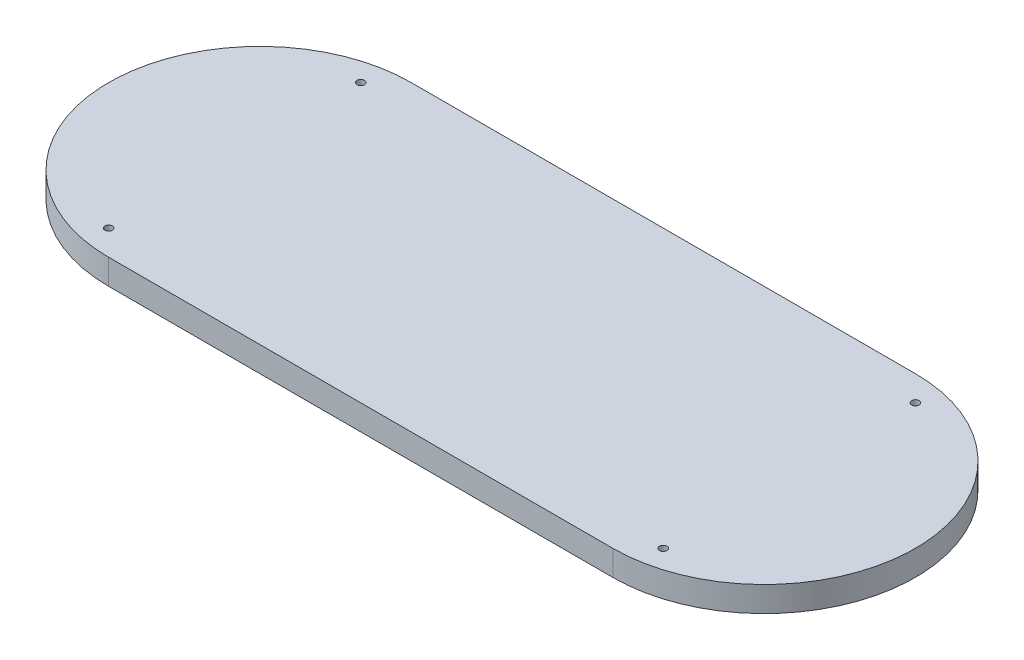
ISO-10303-21;
HEADER;
FILE_DESCRIPTION(('STEP AP214'),'2;1');
FILE_NAME('part.step','',(''),(''),'','','');
FILE_SCHEMA(('AUTOMOTIVE_DESIGN { 1 0 10303 214 1 1 1 1 }'));
ENDSEC;
DATA;
#1=APPLICATION_CONTEXT('core data for automotive mechanical design processes');
#2=APPLICATION_PROTOCOL_DEFINITION('international standard','automotive_design',2000,#1);
#3=PRODUCT_CONTEXT('',#1,'mechanical');
#4=PRODUCT('Part','Part','',(#3));
#5=PRODUCT_RELATED_PRODUCT_CATEGORY('part','',(#4));
#6=PRODUCT_DEFINITION_FORMATION('','',#4);
#7=PRODUCT_DEFINITION_CONTEXT('part definition',#1,'design');
#8=PRODUCT_DEFINITION('design','',#6,#7);
#9=PRODUCT_DEFINITION_SHAPE('','',#8);
#10=(LENGTH_UNIT() NAMED_UNIT(*) SI_UNIT(.MILLI.,.METRE.));
#11=(NAMED_UNIT(*) PLANE_ANGLE_UNIT() SI_UNIT($,.RADIAN.));
#12=(NAMED_UNIT(*) SI_UNIT($,.STERADIAN.) SOLID_ANGLE_UNIT());
#13=UNCERTAINTY_MEASURE_WITH_UNIT(LENGTH_MEASURE(1.E-05),#10,'distance_accuracy_value','');
#14=(GEOMETRIC_REPRESENTATION_CONTEXT(3) GLOBAL_UNCERTAINTY_ASSIGNED_CONTEXT((#13)) GLOBAL_UNIT_ASSIGNED_CONTEXT((#10,
#11,#12)) REPRESENTATION_CONTEXT('',''));
#15=CARTESIAN_POINT('',(0.,0.,0.));
#16=DIRECTION('',(0.,0.,1.));
#17=DIRECTION('',(1.,0.,0.));
#18=AXIS2_PLACEMENT_3D('',#15,#16,#17);
#19=CARTESIAN_POINT('',(-100.,10.,0.));
#20=DIRECTION('',(0.,-1.,0.));
#21=DIRECTION('',(0.,0.,-1.));
#22=AXIS2_PLACEMENT_3D('',#19,#20,#21);
#23=CYLINDRICAL_SURFACE('',#22,60.);
#24=CARTESIAN_POINT('',(-100.,0.,0.));
#25=DIRECTION('',(0.,1.,0.));
#26=DIRECTION('',(0.,0.,1.));
#27=AXIS2_PLACEMENT_3D('',#24,#25,#26);
#28=CIRCLE('',#27,60.);
#29=CARTESIAN_POINT('',(-100.,0.,-60.));
#30=VERTEX_POINT('',#29);
#31=CARTESIAN_POINT('',(-100.,0.,60.));
#32=VERTEX_POINT('',#31);
#33=EDGE_CURVE('E107',#30,#32,#28,.T.);
#34=ORIENTED_EDGE('',*,*,#33,.T.);
#35=DIRECTION('',(0.,-1.,0.));
#36=VECTOR('',#35,1.);
#37=CARTESIAN_POINT('',(-100.,10.,60.));
#38=LINE('',#37,#36);
#39=CARTESIAN_POINT('',(-100.,10.,60.));
#40=VERTEX_POINT('',#39);
#41=EDGE_CURVE('E11',#40,#32,#38,.T.);
#42=ORIENTED_EDGE('',*,*,#41,.F.);
#43=CARTESIAN_POINT('',(-100.,10.,0.));
#44=DIRECTION('',(0.,1.,0.));
#45=DIRECTION('',(0.,0.,1.));
#46=AXIS2_PLACEMENT_3D('',#43,#44,#45);
#47=CIRCLE('',#46,60.);
#48=CARTESIAN_POINT('',(-100.,10.,-60.));
#49=VERTEX_POINT('',#48);
#50=EDGE_CURVE('E91',#49,#40,#47,.T.);
#51=ORIENTED_EDGE('',*,*,#50,.F.);
#52=DIRECTION('',(0.,-1.,0.));
#53=VECTOR('',#52,1.);
#54=CARTESIAN_POINT('',(-100.,10.,-60.));
#55=LINE('',#54,#53);
#56=EDGE_CURVE('E103',#49,#30,#55,.T.);
#57=ORIENTED_EDGE('',*,*,#56,.T.);
#58=EDGE_LOOP('',(#34,#42,#51,#57));
#59=FACE_BOUND('',#58,.T.);
#60=ADVANCED_FACE('F39',(#59),#23,.T.);
#61=CARTESIAN_POINT('',(-100.,10.,60.));
#62=DIRECTION('',(0.,0.,-1.));
#63=DIRECTION('',(-1.,0.,0.));
#64=AXIS2_PLACEMENT_3D('',#61,#62,#63);
#65=PLANE('',#64);
#66=DIRECTION('',(1.,0.,0.));
#67=VECTOR('',#66,1.);
#68=CARTESIAN_POINT('',(-100.,0.,60.));
#69=LINE('',#68,#67);
#70=CARTESIAN_POINT('',(100.,0.,60.));
#71=VERTEX_POINT('',#70);
#72=EDGE_CURVE('E96',#32,#71,#69,.T.);
#73=ORIENTED_EDGE('',*,*,#72,.T.);
#74=DIRECTION('',(0.,-1.,0.));
#75=VECTOR('',#74,1.);
#76=CARTESIAN_POINT('',(100.,10.,60.));
#77=LINE('',#76,#75);
#78=CARTESIAN_POINT('',(100.,10.,60.));
#79=VERTEX_POINT('',#78);
#80=EDGE_CURVE('E48',#79,#71,#77,.T.);
#81=ORIENTED_EDGE('',*,*,#80,.F.);
#82=DIRECTION('',(1.,0.,0.));
#83=VECTOR('',#82,1.);
#84=CARTESIAN_POINT('',(-100.,10.,60.));
#85=LINE('',#84,#83);
#86=EDGE_CURVE('E86',#40,#79,#85,.T.);
#87=ORIENTED_EDGE('',*,*,#86,.F.);
#88=ORIENTED_EDGE('',*,*,#41,.T.);
#89=EDGE_LOOP('',(#73,#81,#87,#88));
#90=FACE_BOUND('',#89,.T.);
#91=ADVANCED_FACE('F95',(#90),#65,.F.);
#92=CARTESIAN_POINT('',(100.,10.,0.));
#93=DIRECTION('',(0.,-1.,0.));
#94=DIRECTION('',(0.,0.,-1.));
#95=AXIS2_PLACEMENT_3D('',#92,#93,#94);
#96=CYLINDRICAL_SURFACE('',#95,60.);
#97=CARTESIAN_POINT('',(100.,0.,0.));
#98=DIRECTION('',(0.,1.,0.));
#99=DIRECTION('',(0.,0.,1.));
#100=AXIS2_PLACEMENT_3D('',#97,#98,#99);
#101=CIRCLE('',#100,60.);
#102=CARTESIAN_POINT('',(100.,0.,-60.));
#103=VERTEX_POINT('',#102);
#104=EDGE_CURVE('E73',#71,#103,#101,.T.);
#105=ORIENTED_EDGE('',*,*,#104,.T.);
#106=DIRECTION('',(0.,-1.,0.));
#107=VECTOR('',#106,1.);
#108=CARTESIAN_POINT('',(100.,10.,-60.));
#109=LINE('',#108,#107);
#110=CARTESIAN_POINT('',(100.,10.,-60.));
#111=VERTEX_POINT('',#110);
#112=EDGE_CURVE('E98',#111,#103,#109,.T.);
#113=ORIENTED_EDGE('',*,*,#112,.F.);
#114=CARTESIAN_POINT('',(100.,10.,0.));
#115=DIRECTION('',(0.,1.,0.));
#116=DIRECTION('',(0.,0.,1.));
#117=AXIS2_PLACEMENT_3D('',#114,#115,#116);
#118=CIRCLE('',#117,60.);
#119=EDGE_CURVE('E89',#79,#111,#118,.T.);
#120=ORIENTED_EDGE('',*,*,#119,.F.);
#121=ORIENTED_EDGE('',*,*,#80,.T.);
#122=EDGE_LOOP('',(#105,#113,#120,#121));
#123=FACE_BOUND('',#122,.T.);
#124=ADVANCED_FACE('F99',(#123),#96,.T.);
#125=CARTESIAN_POINT('',(-100.,10.,-60.));
#126=DIRECTION('',(0.,0.,1.));
#127=DIRECTION('',(1.,0.,0.));
#128=AXIS2_PLACEMENT_3D('',#125,#126,#127);
#129=PLANE('',#128);
#130=DIRECTION('',(-1.,0.,0.));
#131=VECTOR('',#130,1.);
#132=CARTESIAN_POINT('',(-100.,0.,-60.));
#133=LINE('',#132,#131);
#134=EDGE_CURVE('E79',#103,#30,#133,.T.);
#135=ORIENTED_EDGE('',*,*,#134,.T.);
#136=ORIENTED_EDGE('',*,*,#56,.F.);
#137=DIRECTION('',(-1.,0.,0.));
#138=VECTOR('',#137,1.);
#139=CARTESIAN_POINT('',(-100.,10.,-60.));
#140=LINE('',#139,#138);
#141=EDGE_CURVE('E56',#111,#49,#140,.T.);
#142=ORIENTED_EDGE('',*,*,#141,.F.);
#143=ORIENTED_EDGE('',*,*,#112,.T.);
#144=EDGE_LOOP('',(#135,#136,#142,#143));
#145=FACE_BOUND('',#144,.T.);
#146=ADVANCED_FACE('F121',(#145),#129,.F.);
#147=CARTESIAN_POINT('',(-100.,10.,0.));
#148=DIRECTION('',(0.,1.,0.));
#149=DIRECTION('',(0.,0.,1.));
#150=AXIS2_PLACEMENT_3D('',#147,#148,#149);
#151=PLANE('',#150);
#152=CARTESIAN_POINT('',(110.,10.,-50.));
#153=DIRECTION('',(0.,1.,0.));
#154=DIRECTION('',(0.,0.,1.));
#155=AXIS2_PLACEMENT_3D('',#152,#153,#154);
#156=CIRCLE('',#155,1.5);
#157=CARTESIAN_POINT('',(110.,10.,-48.5));
#158=VERTEX_POINT('',#157);
#159=EDGE_CURVE('E136',#158,#158,#156,.T.);
#160=ORIENTED_EDGE('',*,*,#159,.F.);
#161=EDGE_LOOP('',(#160));
#162=FACE_BOUND('',#161,.T.);
#163=CARTESIAN_POINT('',(110.,10.,50.));
#164=DIRECTION('',(0.,1.,0.));
#165=DIRECTION('',(0.,0.,1.));
#166=AXIS2_PLACEMENT_3D('',#163,#164,#165);
#167=CIRCLE('',#166,1.5);
#168=CARTESIAN_POINT('',(110.,10.,51.5));
#169=VERTEX_POINT('',#168);
#170=EDGE_CURVE('E144',#169,#169,#167,.T.);
#171=ORIENTED_EDGE('',*,*,#170,.F.);
#172=EDGE_LOOP('',(#171));
#173=FACE_BOUND('',#172,.T.);
#174=CARTESIAN_POINT('',(-110.,10.,50.));
#175=DIRECTION('',(0.,1.,0.));
#176=DIRECTION('',(0.,0.,1.));
#177=AXIS2_PLACEMENT_3D('',#174,#175,#176);
#178=CIRCLE('',#177,1.5);
#179=CARTESIAN_POINT('',(-110.,10.,51.5));
#180=VERTEX_POINT('',#179);
#181=EDGE_CURVE('E152',#180,#180,#178,.T.);
#182=ORIENTED_EDGE('',*,*,#181,.F.);
#183=EDGE_LOOP('',(#182));
#184=FACE_BOUND('',#183,.T.);
#185=CARTESIAN_POINT('',(-110.,10.,-50.));
#186=DIRECTION('',(0.,1.,0.));
#187=DIRECTION('',(0.,0.,1.));
#188=AXIS2_PLACEMENT_3D('',#185,#186,#187);
#189=CIRCLE('',#188,1.5);
#190=CARTESIAN_POINT('',(-110.,10.,-48.5));
#191=VERTEX_POINT('',#190);
#192=EDGE_CURVE('E128',#191,#191,#189,.T.);
#193=ORIENTED_EDGE('',*,*,#192,.F.);
#194=EDGE_LOOP('',(#193));
#195=FACE_BOUND('',#194,.T.);
#196=ORIENTED_EDGE('',*,*,#50,.T.);
#197=ORIENTED_EDGE('',*,*,#86,.T.);
#198=ORIENTED_EDGE('',*,*,#119,.T.);
#199=ORIENTED_EDGE('',*,*,#141,.T.);
#200=EDGE_LOOP('',(#196,#197,#198,#199));
#201=FACE_BOUND('',#200,.T.);
#202=ADVANCED_FACE('F87',(#162,#173,#184,#195,#201),#151,.T.);
#203=CARTESIAN_POINT('',(-100.,0.,0.));
#204=DIRECTION('',(0.,1.,0.));
#205=DIRECTION('',(0.,0.,1.));
#206=AXIS2_PLACEMENT_3D('',#203,#204,#205);
#207=PLANE('',#206);
#208=CARTESIAN_POINT('',(110.,0.,-50.));
#209=DIRECTION('',(0.,1.,0.));
#210=DIRECTION('',(0.,0.,1.));
#211=AXIS2_PLACEMENT_3D('',#208,#209,#210);
#212=CIRCLE('',#211,1.5);
#213=CARTESIAN_POINT('',(110.,0.,-48.5));
#214=VERTEX_POINT('',#213);
#215=EDGE_CURVE('E140',#214,#214,#212,.T.);
#216=ORIENTED_EDGE('',*,*,#215,.T.);
#217=EDGE_LOOP('',(#216));
#218=FACE_BOUND('',#217,.T.);
#219=CARTESIAN_POINT('',(110.,0.,50.));
#220=DIRECTION('',(0.,1.,0.));
#221=DIRECTION('',(0.,0.,1.));
#222=AXIS2_PLACEMENT_3D('',#219,#220,#221);
#223=CIRCLE('',#222,1.5);
#224=CARTESIAN_POINT('',(110.,0.,51.5));
#225=VERTEX_POINT('',#224);
#226=EDGE_CURVE('E148',#225,#225,#223,.T.);
#227=ORIENTED_EDGE('',*,*,#226,.T.);
#228=EDGE_LOOP('',(#227));
#229=FACE_BOUND('',#228,.T.);
#230=CARTESIAN_POINT('',(-110.,0.,50.));
#231=DIRECTION('',(0.,1.,0.));
#232=DIRECTION('',(0.,0.,1.));
#233=AXIS2_PLACEMENT_3D('',#230,#231,#232);
#234=CIRCLE('',#233,1.5);
#235=CARTESIAN_POINT('',(-110.,0.,51.5));
#236=VERTEX_POINT('',#235);
#237=EDGE_CURVE('E132',#236,#236,#234,.T.);
#238=ORIENTED_EDGE('',*,*,#237,.T.);
#239=EDGE_LOOP('',(#238));
#240=FACE_BOUND('',#239,.T.);
#241=CARTESIAN_POINT('',(-110.,0.,-50.));
#242=DIRECTION('',(0.,1.,0.));
#243=DIRECTION('',(0.,0.,1.));
#244=AXIS2_PLACEMENT_3D('',#241,#242,#243);
#245=CIRCLE('',#244,1.5);
#246=CARTESIAN_POINT('',(-110.,0.,-48.5));
#247=VERTEX_POINT('',#246);
#248=EDGE_CURVE('E111',#247,#247,#245,.T.);
#249=ORIENTED_EDGE('',*,*,#248,.T.);
#250=EDGE_LOOP('',(#249));
#251=FACE_BOUND('',#250,.T.);
#252=ORIENTED_EDGE('',*,*,#33,.F.);
#253=ORIENTED_EDGE('',*,*,#134,.F.);
#254=ORIENTED_EDGE('',*,*,#104,.F.);
#255=ORIENTED_EDGE('',*,*,#72,.F.);
#256=EDGE_LOOP('',(#252,#253,#254,#255));
#257=FACE_BOUND('',#256,.T.);
#258=ADVANCED_FACE('F124',(#218,#229,#240,#251,#257),#207,.F.);
#259=CARTESIAN_POINT('',(-110.,0.,-50.));
#260=DIRECTION('',(0.,1.,0.));
#261=DIRECTION('',(0.,0.,1.));
#262=AXIS2_PLACEMENT_3D('',#259,#260,#261);
#263=CYLINDRICAL_SURFACE('',#262,1.5);
#264=ORIENTED_EDGE('',*,*,#248,.F.);
#265=EDGE_LOOP('',(#264));
#266=FACE_BOUND('',#265,.T.);
#267=ORIENTED_EDGE('',*,*,#192,.T.);
#268=EDGE_LOOP('',(#267));
#269=FACE_BOUND('',#268,.T.);
#270=ADVANCED_FACE('F166',(#266,#269),#263,.F.);
#271=CARTESIAN_POINT('',(-110.,0.,50.));
#272=DIRECTION('',(0.,1.,0.));
#273=DIRECTION('',(0.,0.,1.));
#274=AXIS2_PLACEMENT_3D('',#271,#272,#273);
#275=CYLINDRICAL_SURFACE('',#274,1.5);
#276=ORIENTED_EDGE('',*,*,#237,.F.);
#277=EDGE_LOOP('',(#276));
#278=FACE_BOUND('',#277,.T.);
#279=ORIENTED_EDGE('',*,*,#181,.T.);
#280=EDGE_LOOP('',(#279));
#281=FACE_BOUND('',#280,.T.);
#282=ADVANCED_FACE('F162',(#278,#281),#275,.F.);
#283=CARTESIAN_POINT('',(110.,0.,50.));
#284=DIRECTION('',(0.,1.,0.));
#285=DIRECTION('',(0.,0.,1.));
#286=AXIS2_PLACEMENT_3D('',#283,#284,#285);
#287=CYLINDRICAL_SURFACE('',#286,1.5);
#288=ORIENTED_EDGE('',*,*,#226,.F.);
#289=EDGE_LOOP('',(#288));
#290=FACE_BOUND('',#289,.T.);
#291=ORIENTED_EDGE('',*,*,#170,.T.);
#292=EDGE_LOOP('',(#291));
#293=FACE_BOUND('',#292,.T.);
#294=ADVANCED_FACE('F165',(#290,#293),#287,.F.);
#295=CARTESIAN_POINT('',(110.,0.,-50.));
#296=DIRECTION('',(0.,1.,0.));
#297=DIRECTION('',(0.,0.,1.));
#298=AXIS2_PLACEMENT_3D('',#295,#296,#297);
#299=CYLINDRICAL_SURFACE('',#298,1.5);
#300=ORIENTED_EDGE('',*,*,#215,.F.);
#301=EDGE_LOOP('',(#300));
#302=FACE_BOUND('',#301,.T.);
#303=ORIENTED_EDGE('',*,*,#159,.T.);
#304=EDGE_LOOP('',(#303));
#305=FACE_BOUND('',#304,.T.);
#306=ADVANCED_FACE('F227',(#302,#305),#299,.F.);
#307=CLOSED_SHELL('',(#60,#91,#124,#146,#202,#258,#270,#282,#294,#306));
#308=MANIFOLD_SOLID_BREP('B2',#307);
#309=ADVANCED_BREP_SHAPE_REPRESENTATION('',(#18,#308),#14);
#310=SHAPE_DEFINITION_REPRESENTATION(#9,#309);
ENDSEC;
END-ISO-10303-21;
